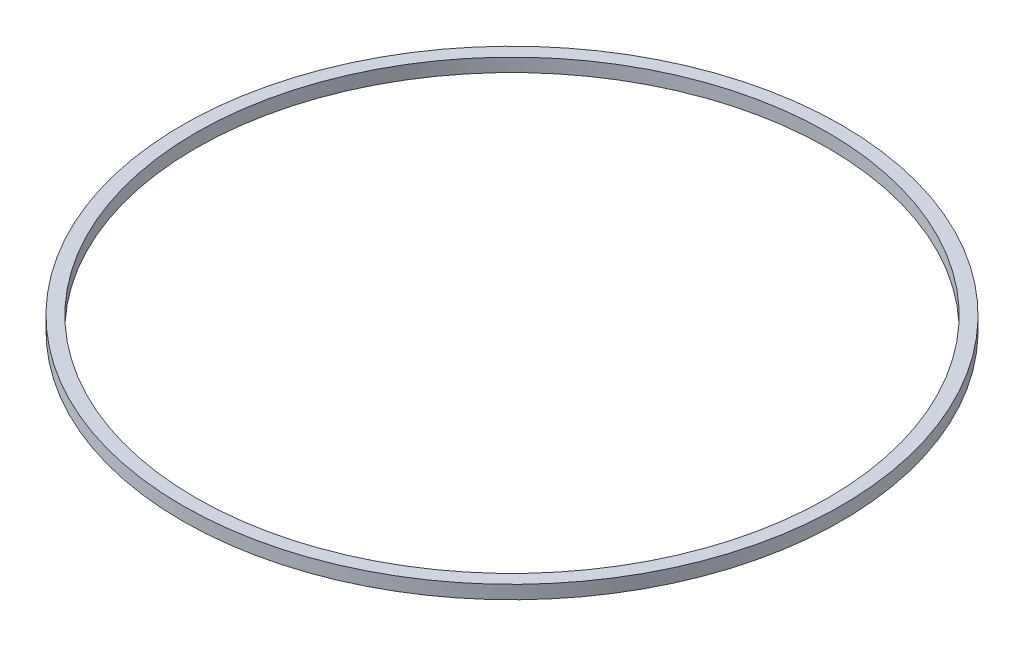
ISO-10303-21;
HEADER;
FILE_DESCRIPTION(('STEP AP214'),'2;1');
FILE_NAME('part.step','',(''),(''),'','','');
FILE_SCHEMA(('AUTOMOTIVE_DESIGN { 1 0 10303 214 1 1 1 1 }'));
ENDSEC;
DATA;
#1=APPLICATION_CONTEXT('core data for automotive mechanical design processes');
#2=APPLICATION_PROTOCOL_DEFINITION('international standard','automotive_design',2000,#1);
#3=PRODUCT_CONTEXT('',#1,'mechanical');
#4=PRODUCT('Part','Part','',(#3));
#5=PRODUCT_RELATED_PRODUCT_CATEGORY('part','',(#4));
#6=PRODUCT_DEFINITION_FORMATION('','',#4);
#7=PRODUCT_DEFINITION_CONTEXT('part definition',#1,'design');
#8=PRODUCT_DEFINITION('design','',#6,#7);
#9=PRODUCT_DEFINITION_SHAPE('','',#8);
#10=(LENGTH_UNIT() NAMED_UNIT(*) SI_UNIT(.MILLI.,.METRE.));
#11=(NAMED_UNIT(*) PLANE_ANGLE_UNIT() SI_UNIT($,.RADIAN.));
#12=(NAMED_UNIT(*) SI_UNIT($,.STERADIAN.) SOLID_ANGLE_UNIT());
#13=UNCERTAINTY_MEASURE_WITH_UNIT(LENGTH_MEASURE(1.E-05),#10,'distance_accuracy_value','');
#14=(GEOMETRIC_REPRESENTATION_CONTEXT(3) GLOBAL_UNCERTAINTY_ASSIGNED_CONTEXT((#13)) GLOBAL_UNIT_ASSIGNED_CONTEXT((#10,
#11,#12)) REPRESENTATION_CONTEXT('',''));
#15=CARTESIAN_POINT('',(0.,0.,0.));
#16=DIRECTION('',(0.,0.,1.));
#17=DIRECTION('',(1.,0.,0.));
#18=AXIS2_PLACEMENT_3D('',#15,#16,#17);
#19=CARTESIAN_POINT('',(0.,0.,0.));
#20=DIRECTION('',(0.,-1.,0.));
#21=DIRECTION('',(0.,0.,-1.));
#22=AXIS2_PLACEMENT_3D('',#19,#20,#21);
#23=CYLINDRICAL_SURFACE('',#22,50.1338);
#24=CARTESIAN_POINT('',(0.,2.12132034355962,0.));
#25=DIRECTION('',(0.,-1.,0.));
#26=DIRECTION('',(0.,0.,-1.));
#27=AXIS2_PLACEMENT_3D('',#24,#25,#26);
#28=CIRCLE('',#27,50.1338);
#29=CARTESIAN_POINT('',(0.,2.12132034355962,-50.1338));
#30=VERTEX_POINT('',#29);
#31=EDGE_CURVE('E54',#30,#30,#28,.T.);
#32=ORIENTED_EDGE('',*,*,#31,.F.);
#33=EDGE_LOOP('',(#32));
#34=FACE_BOUND('',#33,.T.);
#35=CARTESIAN_POINT('',(0.,0.,0.));
#36=DIRECTION('',(0.,-1.,0.));
#37=DIRECTION('',(0.,0.,-1.));
#38=AXIS2_PLACEMENT_3D('',#35,#36,#37);
#39=CIRCLE('',#38,50.1338);
#40=CARTESIAN_POINT('',(0.,0.,-50.1338));
#41=VERTEX_POINT('',#40);
#42=EDGE_CURVE('E10',#41,#41,#39,.T.);
#43=ORIENTED_EDGE('',*,*,#42,.T.);
#44=EDGE_LOOP('',(#43));
#45=FACE_BOUND('',#44,.T.);
#46=ADVANCED_FACE('F37',(#34,#45),#23,.F.);
#47=CARTESIAN_POINT('',(-50.1338,0.,0.));
#48=DIRECTION('',(0.,1.,0.));
#49=DIRECTION('',(0.,0.,1.));
#50=AXIS2_PLACEMENT_3D('',#47,#48,#49);
#51=PLANE('',#50);
#52=ORIENTED_EDGE('',*,*,#42,.F.);
#53=EDGE_LOOP('',(#52));
#54=FACE_BOUND('',#53,.T.);
#55=CARTESIAN_POINT('',(0.,0.,0.));
#56=DIRECTION('',(0.,-1.,0.));
#57=DIRECTION('',(0.,0.,-1.));
#58=AXIS2_PLACEMENT_3D('',#55,#56,#57);
#59=CIRCLE('',#58,52.2551203435597);
#60=CARTESIAN_POINT('',(0.,0.,-52.2551203435597));
#61=VERTEX_POINT('',#60);
#62=EDGE_CURVE('E44',#61,#61,#59,.T.);
#63=ORIENTED_EDGE('',*,*,#62,.T.);
#64=EDGE_LOOP('',(#63));
#65=FACE_BOUND('',#64,.T.);
#66=ADVANCED_FACE('F64',(#54,#65),#51,.F.);
#67=CARTESIAN_POINT('',(0.,0.,0.));
#68=DIRECTION('',(0.,-1.,0.));
#69=DIRECTION('',(0.,0.,-1.));
#70=AXIS2_PLACEMENT_3D('',#67,#68,#69);
#71=CYLINDRICAL_SURFACE('',#70,52.2551203435597);
#72=ORIENTED_EDGE('',*,*,#62,.F.);
#73=EDGE_LOOP('',(#72));
#74=FACE_BOUND('',#73,.T.);
#75=CARTESIAN_POINT('',(0.,2.12132034355962,0.));
#76=DIRECTION('',(0.,-1.,0.));
#77=DIRECTION('',(0.,0.,-1.));
#78=AXIS2_PLACEMENT_3D('',#75,#76,#77);
#79=CIRCLE('',#78,52.2551203435597);
#80=CARTESIAN_POINT('',(0.,2.12132034355962,-52.2551203435597));
#81=VERTEX_POINT('',#80);
#82=EDGE_CURVE('E49',#81,#81,#79,.T.);
#83=ORIENTED_EDGE('',*,*,#82,.T.);
#84=EDGE_LOOP('',(#83));
#85=FACE_BOUND('',#84,.T.);
#86=ADVANCED_FACE('F68',(#74,#85),#71,.T.);
#87=CARTESIAN_POINT('',(-52.2551203435597,2.12132034355962,0.));
#88=DIRECTION('',(0.,-1.,0.));
#89=DIRECTION('',(0.,0.,-1.));
#90=AXIS2_PLACEMENT_3D('',#87,#88,#89);
#91=PLANE('',#90);
#92=ORIENTED_EDGE('',*,*,#82,.F.);
#93=EDGE_LOOP('',(#92));
#94=FACE_BOUND('',#93,.T.);
#95=ORIENTED_EDGE('',*,*,#31,.T.);
#96=EDGE_LOOP('',(#95));
#97=FACE_BOUND('',#96,.T.);
#98=ADVANCED_FACE('F61',(#94,#97),#91,.F.);
#99=CLOSED_SHELL('',(#46,#66,#86,#98));
#100=MANIFOLD_SOLID_BREP('B2',#99);
#101=ADVANCED_BREP_SHAPE_REPRESENTATION('',(#18,#100),#14);
#102=SHAPE_DEFINITION_REPRESENTATION(#9,#101);
ENDSEC;
END-ISO-10303-21;
